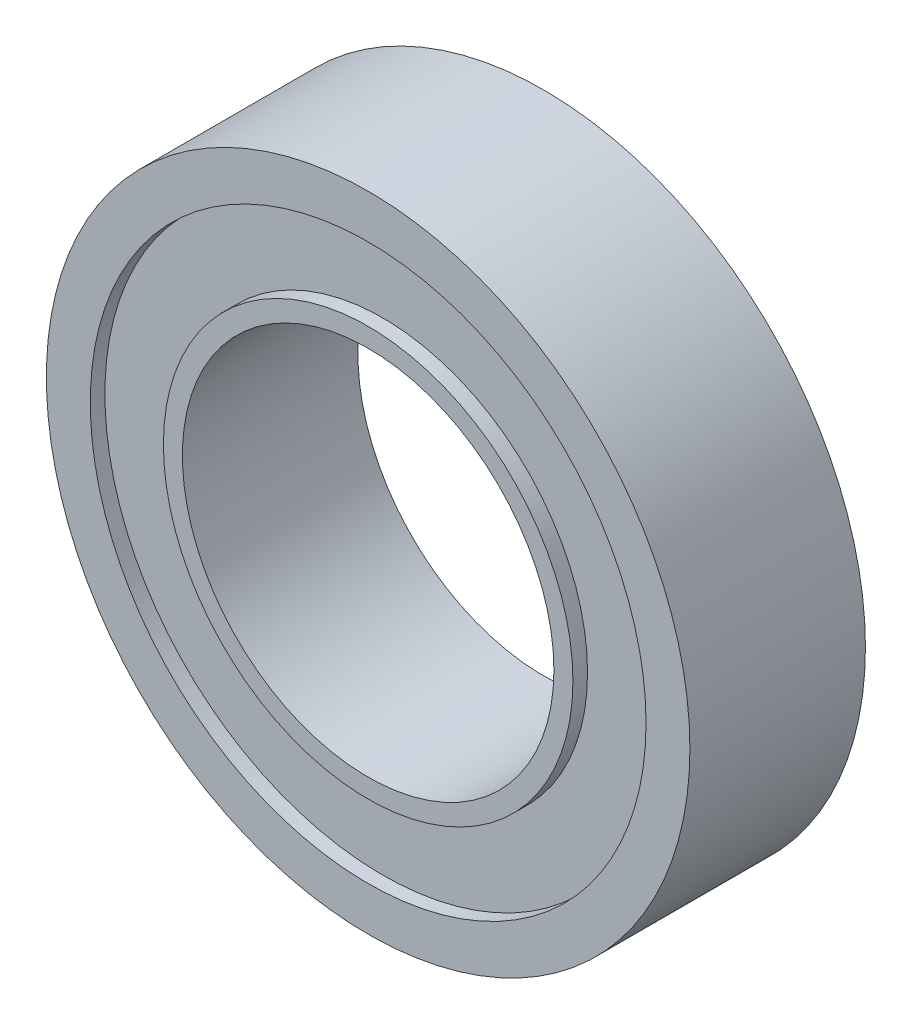
ISO-10303-21;
HEADER;
FILE_DESCRIPTION(('STEP AP214'),'2;1');
FILE_NAME('part.step','',(''),(''),'','','');
FILE_SCHEMA(('AUTOMOTIVE_DESIGN { 1 0 10303 214 1 1 1 1 }'));
ENDSEC;
DATA;
#1=APPLICATION_CONTEXT('core data for automotive mechanical design processes');
#2=APPLICATION_PROTOCOL_DEFINITION('international standard','automotive_design',2000,#1);
#3=PRODUCT_CONTEXT('',#1,'mechanical');
#4=PRODUCT('Part','Part','',(#3));
#5=PRODUCT_RELATED_PRODUCT_CATEGORY('part','',(#4));
#6=PRODUCT_DEFINITION_FORMATION('','',#4);
#7=PRODUCT_DEFINITION_CONTEXT('part definition',#1,'design');
#8=PRODUCT_DEFINITION('design','',#6,#7);
#9=PRODUCT_DEFINITION_SHAPE('','',#8);
#10=(LENGTH_UNIT() NAMED_UNIT(*) SI_UNIT(.MILLI.,.METRE.));
#11=(NAMED_UNIT(*) PLANE_ANGLE_UNIT() SI_UNIT($,.RADIAN.));
#12=(NAMED_UNIT(*) SI_UNIT($,.STERADIAN.) SOLID_ANGLE_UNIT());
#13=UNCERTAINTY_MEASURE_WITH_UNIT(LENGTH_MEASURE(1.E-05),#10,'distance_accuracy_value','');
#14=(GEOMETRIC_REPRESENTATION_CONTEXT(3) GLOBAL_UNCERTAINTY_ASSIGNED_CONTEXT((#13)) GLOBAL_UNIT_ASSIGNED_CONTEXT((#10,
#11,#12)) REPRESENTATION_CONTEXT('',''));
#15=CARTESIAN_POINT('',(0.,0.,0.));
#16=DIRECTION('',(0.,0.,1.));
#17=DIRECTION('',(1.,0.,0.));
#18=AXIS2_PLACEMENT_3D('',#15,#16,#17);
#19=CARTESIAN_POINT('',(0.,0.,0.));
#20=DIRECTION('',(0.,0.,1.));
#21=DIRECTION('',(1.,0.,0.));
#22=AXIS2_PLACEMENT_3D('',#19,#20,#21);
#23=CYLINDRICAL_SURFACE('',#22,6.35);
#24=CARTESIAN_POINT('',(0.,0.,2.99999999999999));
#25=DIRECTION('',(0.,0.,1.));
#26=DIRECTION('',(1.,0.,0.));
#27=AXIS2_PLACEMENT_3D('',#24,#25,#26);
#28=CIRCLE('',#27,6.35);
#29=CARTESIAN_POINT('',(6.35,0.,2.99999999999999));
#30=VERTEX_POINT('',#29);
#31=EDGE_CURVE('E52',#30,#30,#28,.T.);
#32=ORIENTED_EDGE('',*,*,#31,.T.);
#33=EDGE_LOOP('',(#32));
#34=FACE_BOUND('',#33,.T.);
#35=CARTESIAN_POINT('',(0.,0.,-2.99999999999999));
#36=DIRECTION('',(0.,0.,1.));
#37=DIRECTION('',(1.,0.,0.));
#38=AXIS2_PLACEMENT_3D('',#35,#36,#37);
#39=CIRCLE('',#38,6.35);
#40=CARTESIAN_POINT('',(6.35,0.,-2.99999999999999));
#41=VERTEX_POINT('',#40);
#42=EDGE_CURVE('E18',#41,#41,#39,.T.);
#43=ORIENTED_EDGE('',*,*,#42,.F.);
#44=EDGE_LOOP('',(#43));
#45=FACE_BOUND('',#44,.T.);
#46=ADVANCED_FACE('F15',(#34,#45),#23,.F.);
#47=CARTESIAN_POINT('',(0.,0.,-2.99999999999999));
#48=DIRECTION('',(0.,0.,-1.));
#49=DIRECTION('',(-1.,0.,0.));
#50=AXIS2_PLACEMENT_3D('',#47,#48,#49);
#51=PLANE('',#50);
#52=ORIENTED_EDGE('',*,*,#42,.T.);
#53=EDGE_LOOP('',(#52));
#54=FACE_BOUND('',#53,.T.);
#55=CARTESIAN_POINT('',(0.,0.,-2.99999999999999));
#56=DIRECTION('',(0.,0.,1.));
#57=DIRECTION('',(1.,0.,0.));
#58=AXIS2_PLACEMENT_3D('',#55,#56,#57);
#59=CIRCLE('',#58,6.99999999999999);
#60=CARTESIAN_POINT('',(6.99999999999999,0.,-2.99999999999999));
#61=VERTEX_POINT('',#60);
#62=EDGE_CURVE('E50',#61,#61,#59,.T.);
#63=ORIENTED_EDGE('',*,*,#62,.F.);
#64=EDGE_LOOP('',(#63));
#65=FACE_BOUND('',#64,.T.);
#66=ADVANCED_FACE('F59',(#54,#65),#51,.T.);
#67=CARTESIAN_POINT('',(0.,0.,2.99999999999999));
#68=DIRECTION('',(0.,0.,-1.));
#69=DIRECTION('',(-1.,0.,0.));
#70=AXIS2_PLACEMENT_3D('',#67,#68,#69);
#71=PLANE('',#70);
#72=ORIENTED_EDGE('',*,*,#31,.F.);
#73=EDGE_LOOP('',(#72));
#74=FACE_BOUND('',#73,.T.);
#75=CARTESIAN_POINT('',(0.,0.,2.99999999999999));
#76=DIRECTION('',(0.,0.,1.));
#77=DIRECTION('',(1.,0.,0.));
#78=AXIS2_PLACEMENT_3D('',#75,#76,#77);
#79=CIRCLE('',#78,6.99999999999999);
#80=CARTESIAN_POINT('',(6.99999999999999,0.,2.99999999999999));
#81=VERTEX_POINT('',#80);
#82=EDGE_CURVE('E47',#81,#81,#79,.F.);
#83=ORIENTED_EDGE('',*,*,#82,.F.);
#84=EDGE_LOOP('',(#83));
#85=FACE_BOUND('',#84,.T.);
#86=ADVANCED_FACE('F67',(#74,#85),#71,.F.);
#87=CARTESIAN_POINT('',(0.,0.,0.));
#88=DIRECTION('',(0.,0.,1.));
#89=DIRECTION('',(1.,0.,0.));
#90=AXIS2_PLACEMENT_3D('',#87,#88,#89);
#91=CYLINDRICAL_SURFACE('',#90,6.99999999999999);
#92=CARTESIAN_POINT('',(0.,0.,-2.50000000000001));
#93=DIRECTION('',(0.,0.,1.));
#94=DIRECTION('',(1.,0.,0.));
#95=AXIS2_PLACEMENT_3D('',#92,#93,#94);
#96=CIRCLE('',#95,6.99999999999999);
#97=CARTESIAN_POINT('',(6.99999999999999,0.,-2.50000000000001));
#98=VERTEX_POINT('',#97);
#99=EDGE_CURVE('E44',#98,#98,#96,.T.);
#100=ORIENTED_EDGE('',*,*,#99,.F.);
#101=EDGE_LOOP('',(#100));
#102=FACE_BOUND('',#101,.T.);
#103=ORIENTED_EDGE('',*,*,#62,.T.);
#104=EDGE_LOOP('',(#103));
#105=FACE_BOUND('',#104,.T.);
#106=ADVANCED_FACE('F102',(#102,#105),#91,.T.);
#107=CARTESIAN_POINT('',(0.,0.,0.));
#108=DIRECTION('',(0.,0.,1.));
#109=DIRECTION('',(1.,0.,0.));
#110=AXIS2_PLACEMENT_3D('',#107,#108,#109);
#111=CYLINDRICAL_SURFACE('',#110,6.99999999999999);
#112=ORIENTED_EDGE('',*,*,#82,.T.);
#113=EDGE_LOOP('',(#112));
#114=FACE_BOUND('',#113,.T.);
#115=CARTESIAN_POINT('',(0.,0.,2.50000000000001));
#116=DIRECTION('',(0.,0.,1.));
#117=DIRECTION('',(1.,0.,0.));
#118=AXIS2_PLACEMENT_3D('',#115,#116,#117);
#119=CIRCLE('',#118,6.99999999999999);
#120=CARTESIAN_POINT('',(6.99999999999999,0.,2.50000000000001));
#121=VERTEX_POINT('',#120);
#122=EDGE_CURVE('E41',#121,#121,#119,.T.);
#123=ORIENTED_EDGE('',*,*,#122,.T.);
#124=EDGE_LOOP('',(#123));
#125=FACE_BOUND('',#124,.T.);
#126=ADVANCED_FACE('F98',(#114,#125),#111,.T.);
#127=CARTESIAN_POINT('',(0.,0.,-2.50000000000001));
#128=DIRECTION('',(0.,0.,-1.));
#129=DIRECTION('',(-1.,0.,0.));
#130=AXIS2_PLACEMENT_3D('',#127,#128,#129);
#131=PLANE('',#130);
#132=ORIENTED_EDGE('',*,*,#99,.T.);
#133=EDGE_LOOP('',(#132));
#134=FACE_BOUND('',#133,.T.);
#135=CARTESIAN_POINT('',(0.,0.,-2.50000000000001));
#136=DIRECTION('',(0.,0.,1.));
#137=DIRECTION('',(1.,0.,0.));
#138=AXIS2_PLACEMENT_3D('',#135,#136,#137);
#139=CIRCLE('',#138,9.5);
#140=CARTESIAN_POINT('',(9.5,0.,-2.50000000000001));
#141=VERTEX_POINT('',#140);
#142=EDGE_CURVE('E38',#141,#141,#139,.F.);
#143=ORIENTED_EDGE('',*,*,#142,.T.);
#144=EDGE_LOOP('',(#143));
#145=FACE_BOUND('',#144,.T.);
#146=ADVANCED_FACE('F94',(#134,#145),#131,.T.);
#147=CARTESIAN_POINT('',(0.,0.,2.50000000000001));
#148=DIRECTION('',(0.,0.,-1.));
#149=DIRECTION('',(-1.,0.,0.));
#150=AXIS2_PLACEMENT_3D('',#147,#148,#149);
#151=PLANE('',#150);
#152=ORIENTED_EDGE('',*,*,#122,.F.);
#153=EDGE_LOOP('',(#152));
#154=FACE_BOUND('',#153,.T.);
#155=CARTESIAN_POINT('',(0.,0.,2.50000000000001));
#156=DIRECTION('',(0.,0.,1.));
#157=DIRECTION('',(1.,0.,0.));
#158=AXIS2_PLACEMENT_3D('',#155,#156,#157);
#159=CIRCLE('',#158,9.5);
#160=CARTESIAN_POINT('',(9.5,0.,2.50000000000001));
#161=VERTEX_POINT('',#160);
#162=EDGE_CURVE('E35',#161,#161,#159,.T.);
#163=ORIENTED_EDGE('',*,*,#162,.T.);
#164=EDGE_LOOP('',(#163));
#165=FACE_BOUND('',#164,.T.);
#166=ADVANCED_FACE('F90',(#154,#165),#151,.F.);
#167=CARTESIAN_POINT('',(0.,0.,0.));
#168=DIRECTION('',(0.,0.,1.));
#169=DIRECTION('',(1.,0.,0.));
#170=AXIS2_PLACEMENT_3D('',#167,#168,#169);
#171=CYLINDRICAL_SURFACE('',#170,9.5);
#172=ORIENTED_EDGE('',*,*,#142,.F.);
#173=EDGE_LOOP('',(#172));
#174=FACE_BOUND('',#173,.T.);
#175=CARTESIAN_POINT('',(0.,0.,-2.99999999999999));
#176=DIRECTION('',(0.,0.,1.));
#177=DIRECTION('',(1.,0.,0.));
#178=AXIS2_PLACEMENT_3D('',#175,#176,#177);
#179=CIRCLE('',#178,9.5);
#180=CARTESIAN_POINT('',(9.5,0.,-2.99999999999999));
#181=VERTEX_POINT('',#180);
#182=EDGE_CURVE('E32',#181,#181,#179,.T.);
#183=ORIENTED_EDGE('',*,*,#182,.F.);
#184=EDGE_LOOP('',(#183));
#185=FACE_BOUND('',#184,.T.);
#186=ADVANCED_FACE('F86',(#174,#185),#171,.F.);
#187=CARTESIAN_POINT('',(0.,0.,0.));
#188=DIRECTION('',(0.,0.,1.));
#189=DIRECTION('',(1.,0.,0.));
#190=AXIS2_PLACEMENT_3D('',#187,#188,#189);
#191=CYLINDRICAL_SURFACE('',#190,9.5);
#192=CARTESIAN_POINT('',(0.,0.,2.99999999999999));
#193=DIRECTION('',(0.,0.,1.));
#194=DIRECTION('',(1.,0.,0.));
#195=AXIS2_PLACEMENT_3D('',#192,#193,#194);
#196=CIRCLE('',#195,9.5);
#197=CARTESIAN_POINT('',(9.5,0.,2.99999999999999));
#198=VERTEX_POINT('',#197);
#199=EDGE_CURVE('E27',#198,#198,#196,.T.);
#200=ORIENTED_EDGE('',*,*,#199,.T.);
#201=EDGE_LOOP('',(#200));
#202=FACE_BOUND('',#201,.T.);
#203=ORIENTED_EDGE('',*,*,#162,.F.);
#204=EDGE_LOOP('',(#203));
#205=FACE_BOUND('',#204,.T.);
#206=ADVANCED_FACE('F82',(#202,#205),#191,.F.);
#207=CARTESIAN_POINT('',(0.,0.,-2.99999999999999));
#208=DIRECTION('',(0.,0.,-1.));
#209=DIRECTION('',(-1.,0.,0.));
#210=AXIS2_PLACEMENT_3D('',#207,#208,#209);
#211=PLANE('',#210);
#212=ORIENTED_EDGE('',*,*,#182,.T.);
#213=EDGE_LOOP('',(#212));
#214=FACE_BOUND('',#213,.T.);
#215=CARTESIAN_POINT('',(0.,0.,-2.99999999999999));
#216=DIRECTION('',(0.,0.,1.));
#217=DIRECTION('',(1.,0.,0.));
#218=AXIS2_PLACEMENT_3D('',#215,#216,#217);
#219=CIRCLE('',#218,11.);
#220=CARTESIAN_POINT('',(11.,0.,-2.99999999999999));
#221=VERTEX_POINT('',#220);
#222=EDGE_CURVE('E22',#221,#221,#219,.T.);
#223=ORIENTED_EDGE('',*,*,#222,.F.);
#224=EDGE_LOOP('',(#223));
#225=FACE_BOUND('',#224,.T.);
#226=ADVANCED_FACE('F76',(#214,#225),#211,.T.);
#227=CARTESIAN_POINT('',(0.,0.,2.99999999999999));
#228=DIRECTION('',(0.,0.,-1.));
#229=DIRECTION('',(-1.,0.,0.));
#230=AXIS2_PLACEMENT_3D('',#227,#228,#229);
#231=PLANE('',#230);
#232=ORIENTED_EDGE('',*,*,#199,.F.);
#233=EDGE_LOOP('',(#232));
#234=FACE_BOUND('',#233,.T.);
#235=CARTESIAN_POINT('',(0.,0.,2.99999999999999));
#236=DIRECTION('',(0.,0.,1.));
#237=DIRECTION('',(1.,0.,0.));
#238=AXIS2_PLACEMENT_3D('',#235,#236,#237);
#239=CIRCLE('',#238,11.);
#240=CARTESIAN_POINT('',(11.,0.,2.99999999999999));
#241=VERTEX_POINT('',#240);
#242=EDGE_CURVE('E10',#241,#241,#239,.F.);
#243=ORIENTED_EDGE('',*,*,#242,.F.);
#244=EDGE_LOOP('',(#243));
#245=FACE_BOUND('',#244,.T.);
#246=ADVANCED_FACE('F70',(#234,#245),#231,.F.);
#247=CARTESIAN_POINT('',(0.,0.,0.));
#248=DIRECTION('',(0.,0.,1.));
#249=DIRECTION('',(1.,0.,0.));
#250=AXIS2_PLACEMENT_3D('',#247,#248,#249);
#251=CYLINDRICAL_SURFACE('',#250,11.);
#252=ORIENTED_EDGE('',*,*,#222,.T.);
#253=EDGE_LOOP('',(#252));
#254=FACE_BOUND('',#253,.T.);
#255=ORIENTED_EDGE('',*,*,#242,.T.);
#256=EDGE_LOOP('',(#255));
#257=FACE_BOUND('',#256,.T.);
#258=ADVANCED_FACE('F68',(#254,#257),#251,.T.);
#259=CLOSED_SHELL('',(#46,#66,#86,#106,#126,#146,#166,#186,#206,#226,#246,#258));
#260=MANIFOLD_SOLID_BREP('B1',#259);
#261=ADVANCED_BREP_SHAPE_REPRESENTATION('',(#18,#260),#14);
#262=SHAPE_DEFINITION_REPRESENTATION(#9,#261);
ENDSEC;
END-ISO-10303-21;
